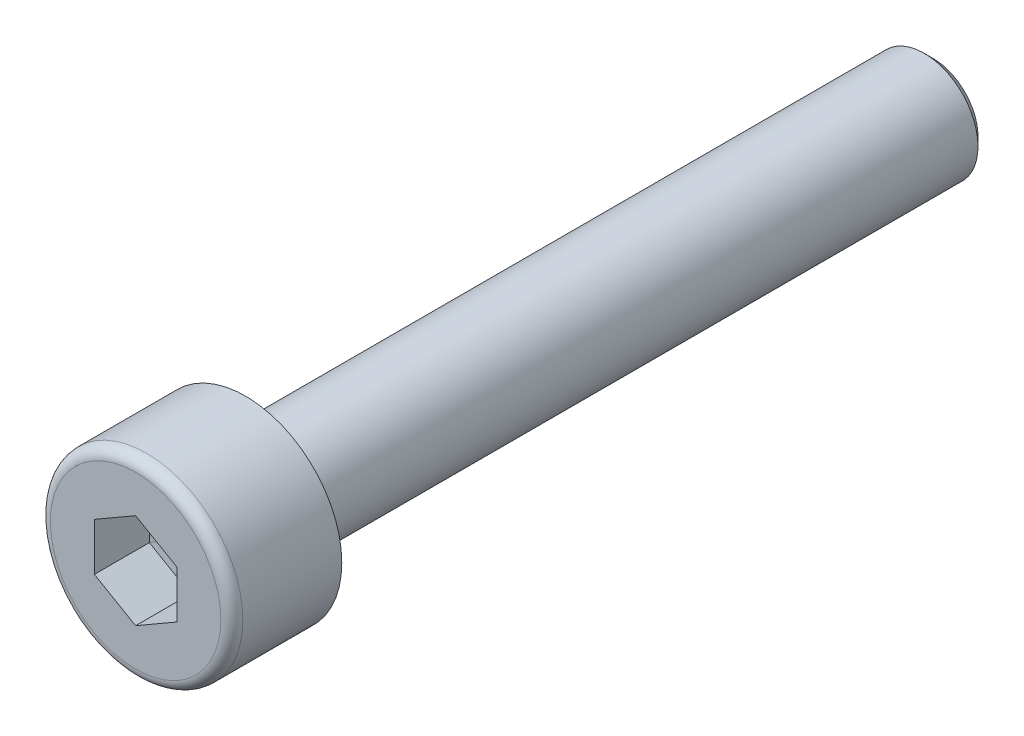
ISO-10303-21;
HEADER;
FILE_DESCRIPTION(('STEP AP214'),'2;1');
FILE_NAME('part.step','',(''),(''),'','','');
FILE_SCHEMA(('AUTOMOTIVE_DESIGN { 1 0 10303 214 1 1 1 1 }'));
ENDSEC;
DATA;
#1=APPLICATION_CONTEXT('core data for automotive mechanical design processes');
#2=APPLICATION_PROTOCOL_DEFINITION('international standard','automotive_design',2000,#1);
#3=PRODUCT_CONTEXT('',#1,'mechanical');
#4=PRODUCT('Part','Part','',(#3));
#5=PRODUCT_RELATED_PRODUCT_CATEGORY('part','',(#4));
#6=PRODUCT_DEFINITION_FORMATION('','',#4);
#7=PRODUCT_DEFINITION_CONTEXT('part definition',#1,'design');
#8=PRODUCT_DEFINITION('design','',#6,#7);
#9=PRODUCT_DEFINITION_SHAPE('','',#8);
#10=(LENGTH_UNIT() NAMED_UNIT(*) SI_UNIT(.MILLI.,.METRE.));
#11=(NAMED_UNIT(*) PLANE_ANGLE_UNIT() SI_UNIT($,.RADIAN.));
#12=(NAMED_UNIT(*) SI_UNIT($,.STERADIAN.) SOLID_ANGLE_UNIT());
#13=UNCERTAINTY_MEASURE_WITH_UNIT(LENGTH_MEASURE(1.E-05),#10,'distance_accuracy_value','');
#14=(GEOMETRIC_REPRESENTATION_CONTEXT(3) GLOBAL_UNCERTAINTY_ASSIGNED_CONTEXT((#13)) GLOBAL_UNIT_ASSIGNED_CONTEXT((#10,
#11,#12)) REPRESENTATION_CONTEXT('',''));
#15=CARTESIAN_POINT('',(0.,0.,0.));
#16=DIRECTION('',(0.,0.,1.));
#17=DIRECTION('',(1.,0.,0.));
#18=AXIS2_PLACEMENT_3D('',#15,#16,#17);
#19=CARTESIAN_POINT('',(-2.,0.,-5.5228302982804E-13));
#20=DIRECTION('',(0.,0.,-1.));
#21=DIRECTION('',(0.,-1.,0.));
#22=AXIS2_PLACEMENT_3D('',#19,#20,#21);
#23=PLANE('',#22);
#24=CARTESIAN_POINT('',(0.,0.,-5.48450174164827E-13));
#25=DIRECTION('',(0.,0.,-1.));
#26=DIRECTION('',(-1.,0.,0.));
#27=AXIS2_PLACEMENT_3D('',#24,#25,#26);
#28=CIRCLE('',#27,1.954);
#29=CARTESIAN_POINT('',(1.954,0.,-5.45177515025882E-13));
#30=VERTEX_POINT('',#29);
#31=EDGE_CURVE('E11',#30,#30,#28,.T.);
#32=ORIENTED_EDGE('',*,*,#31,.F.);
#33=EDGE_LOOP('',(#32));
#34=FACE_BOUND('',#33,.T.);
#35=CARTESIAN_POINT('',(0.,0.,-9.60458843258252E-13));
#36=DIRECTION('',(0.,0.,-1.));
#37=DIRECTION('',(1.,0.,0.));
#38=AXIS2_PLACEMENT_3D('',#35,#36,#37);
#39=CIRCLE('',#38,3.5);
#40=CARTESIAN_POINT('',(3.5,0.,-9.54791801177635E-13));
#41=VERTEX_POINT('',#40);
#42=EDGE_CURVE('E172',#41,#41,#39,.T.);
#43=ORIENTED_EDGE('',*,*,#42,.T.);
#44=EDGE_LOOP('',(#43));
#45=FACE_BOUND('',#44,.T.);
#46=ADVANCED_FACE('F17',(#34,#45),#23,.T.);
#47=CARTESIAN_POINT('',(0.,0.,-25.));
#48=DIRECTION('',(0.,0.,-1.));
#49=DIRECTION('',(0.,-1.,0.));
#50=AXIS2_PLACEMENT_3D('',#47,#48,#49);
#51=PLANE('',#50);
#52=CARTESIAN_POINT('',(0.,0.,-25.));
#53=DIRECTION('',(0.,0.,-1.));
#54=DIRECTION('',(-1.,0.,0.));
#55=AXIS2_PLACEMENT_3D('',#52,#53,#54);
#56=CIRCLE('',#55,1.64000000000802);
#57=CARTESIAN_POINT('',(1.64000000000802,0.,-25.));
#58=VERTEX_POINT('',#57);
#59=EDGE_CURVE('E124',#58,#58,#56,.T.);
#60=ORIENTED_EDGE('',*,*,#59,.T.);
#61=EDGE_LOOP('',(#60));
#62=FACE_BOUND('',#61,.T.);
#63=ADVANCED_FACE('F501',(#62),#51,.T.);
#64=CARTESIAN_POINT('',(0.,0.,-12.5000000000003));
#65=DIRECTION('',(0.,0.,-1.));
#66=DIRECTION('',(-1.,0.,0.));
#67=AXIS2_PLACEMENT_3D('',#64,#65,#66);
#68=CYLINDRICAL_SURFACE('',#67,1.954);
#69=CARTESIAN_POINT('',(0.,0.,-24.6860000000083));
#70=DIRECTION('',(0.,0.,1.));
#71=DIRECTION('',(-1.,0.,0.));
#72=AXIS2_PLACEMENT_3D('',#69,#70,#71);
#73=CIRCLE('',#72,1.954);
#74=CARTESIAN_POINT('',(1.95400000000003,0.,-24.6860000000083));
#75=VERTEX_POINT('',#74);
#76=EDGE_CURVE('E117',#75,#75,#73,.T.);
#77=ORIENTED_EDGE('',*,*,#76,.T.);
#78=DIRECTION('',(0.,0.,1.));
#79=VECTOR('',#78,1.);
#80=CARTESIAN_POINT('',(1.954,0.,-12.5000000000003));
#81=LINE('',#80,#79);
#82=EDGE_CURVE('E20',#75,#30,#81,.T.);
#83=ORIENTED_EDGE('',*,*,#82,.T.);
#84=ORIENTED_EDGE('',*,*,#31,.T.);
#85=ORIENTED_EDGE('',*,*,#82,.F.);
#86=EDGE_LOOP('',(#77,#83,#84,#85));
#87=FACE_BOUND('',#86,.T.);
#88=ADVANCED_FACE('F115',(#87),#68,.T.);
#89=CARTESIAN_POINT('',(-1.5,0.866025403784439,4.));
#90=DIRECTION('',(-0.5,0.866025403784439,0.));
#91=DIRECTION('',(0.,0.,1.));
#92=AXIS2_PLACEMENT_3D('',#89,#90,#91);
#93=PLANE('',#92);
#94=DIRECTION('',(0.866025403784439,0.5,0.));
#95=VECTOR('',#94,1.);
#96=CARTESIAN_POINT('',(-2.4375,0.324759526419163,3.99999999999962));
#97=LINE('',#96,#95);
#98=CARTESIAN_POINT('',(-1.5,0.866025403784439,4.));
#99=VERTEX_POINT('',#98);
#100=CARTESIAN_POINT('',(0.,1.73205080756888,4.));
#101=VERTEX_POINT('',#100);
#102=EDGE_CURVE('E164',#99,#101,#97,.T.);
#103=ORIENTED_EDGE('',*,*,#102,.F.);
#104=DIRECTION('',(0.,0.,-1.));
#105=VECTOR('',#104,1.);
#106=CARTESIAN_POINT('',(-1.5,0.866025403784439,4.));
#107=LINE('',#106,#105);
#108=CARTESIAN_POINT('',(-1.5,0.866025403784439,2.));
#109=VERTEX_POINT('',#108);
#110=EDGE_CURVE('E224',#99,#109,#107,.T.);
#111=ORIENTED_EDGE('',*,*,#110,.T.);
#112=DIRECTION('',(0.866025403784439,0.5,0.));
#113=VECTOR('',#112,1.);
#114=CARTESIAN_POINT('',(0.,1.73205080756888,2.));
#115=LINE('',#114,#113);
#116=CARTESIAN_POINT('',(0.,1.73205080756888,2.));
#117=VERTEX_POINT('',#116);
#118=EDGE_CURVE('E185',#109,#117,#115,.T.);
#119=ORIENTED_EDGE('',*,*,#118,.T.);
#120=DIRECTION('',(0.,0.,-1.));
#121=VECTOR('',#120,1.);
#122=CARTESIAN_POINT('',(0.,1.73205080756888,4.));
#123=LINE('',#122,#121);
#124=EDGE_CURVE('E45',#101,#117,#123,.T.);
#125=ORIENTED_EDGE('',*,*,#124,.F.);
#126=EDGE_LOOP('',(#103,#111,#119,#125));
#127=FACE_BOUND('',#126,.T.);
#128=ADVANCED_FACE('F485',(#127),#93,.F.);
#129=CARTESIAN_POINT('',(0.,1.73205080756888,4.));
#130=DIRECTION('',(0.5,0.866025403784438,0.));
#131=DIRECTION('',(0.,0.,-1.));
#132=AXIS2_PLACEMENT_3D('',#129,#130,#131);
#133=PLANE('',#132);
#134=DIRECTION('',(0.866025403784438,-0.5,0.));
#135=VECTOR('',#134,1.);
#136=CARTESIAN_POINT('',(-0.9375,2.27331668493415,3.99999999999962));
#137=LINE('',#136,#135);
#138=CARTESIAN_POINT('',(1.5,0.866025403784438,4.));
#139=VERTEX_POINT('',#138);
#140=EDGE_CURVE('E167',#101,#139,#137,.T.);
#141=ORIENTED_EDGE('',*,*,#140,.F.);
#142=ORIENTED_EDGE('',*,*,#124,.T.);
#143=DIRECTION('',(0.866025403784438,-0.5,0.));
#144=VECTOR('',#143,1.);
#145=CARTESIAN_POINT('',(1.5,0.866025403784438,2.));
#146=LINE('',#145,#144);
#147=CARTESIAN_POINT('',(1.5,0.866025403784438,2.));
#148=VERTEX_POINT('',#147);
#149=EDGE_CURVE('E217',#117,#148,#146,.T.);
#150=ORIENTED_EDGE('',*,*,#149,.T.);
#151=DIRECTION('',(0.,0.,-1.));
#152=VECTOR('',#151,1.);
#153=CARTESIAN_POINT('',(1.5,0.866025403784438,4.));
#154=LINE('',#153,#152);
#155=EDGE_CURVE('E233',#139,#148,#154,.T.);
#156=ORIENTED_EDGE('',*,*,#155,.F.);
#157=EDGE_LOOP('',(#141,#142,#150,#156));
#158=FACE_BOUND('',#157,.T.);
#159=ADVANCED_FACE('F475',(#158),#133,.F.);
#160=CARTESIAN_POINT('',(1.5,0.866025403784438,4.));
#161=DIRECTION('',(1.,0.,0.));
#162=DIRECTION('',(0.,-1.,0.));
#163=AXIS2_PLACEMENT_3D('',#160,#161,#162);
#164=PLANE('',#163);
#165=DIRECTION('',(0.,-1.,0.));
#166=VECTOR('',#165,1.);
#167=CARTESIAN_POINT('',(1.5,0.433012701892219,3.99999999999963));
#168=LINE('',#167,#166);
#169=CARTESIAN_POINT('',(1.5,-0.866025403784439,4.));
#170=VERTEX_POINT('',#169);
#171=EDGE_CURVE('E151',#139,#170,#168,.T.);
#172=ORIENTED_EDGE('',*,*,#171,.F.);
#173=ORIENTED_EDGE('',*,*,#155,.T.);
#174=DIRECTION('',(0.,-1.,0.));
#175=VECTOR('',#174,1.);
#176=CARTESIAN_POINT('',(1.5,-0.866025403784439,2.));
#177=LINE('',#176,#175);
#178=CARTESIAN_POINT('',(1.5,-0.866025403784439,2.));
#179=VERTEX_POINT('',#178);
#180=EDGE_CURVE('E209',#148,#179,#177,.T.);
#181=ORIENTED_EDGE('',*,*,#180,.T.);
#182=DIRECTION('',(0.,0.,-1.));
#183=VECTOR('',#182,1.);
#184=CARTESIAN_POINT('',(1.5,-0.866025403784439,4.));
#185=LINE('',#184,#183);
#186=EDGE_CURVE('E230',#170,#179,#185,.T.);
#187=ORIENTED_EDGE('',*,*,#186,.F.);
#188=EDGE_LOOP('',(#172,#173,#181,#187));
#189=FACE_BOUND('',#188,.T.);
#190=ADVANCED_FACE('F464',(#189),#164,.F.);
#191=CARTESIAN_POINT('',(1.5,-0.866025403784439,4.));
#192=DIRECTION('',(0.5,-0.866025403784439,0.));
#193=DIRECTION('',(0.,0.,-1.));
#194=AXIS2_PLACEMENT_3D('',#191,#192,#193);
#195=PLANE('',#194);
#196=DIRECTION('',(-0.866025403784439,-0.5,0.));
#197=VECTOR('',#196,1.);
#198=CARTESIAN_POINT('',(-0.187500000000004,-1.84030398304193,3.99999999999962));
#199=LINE('',#198,#197);
#200=CARTESIAN_POINT('',(0.,-1.73205080756888,4.));
#201=VERTEX_POINT('',#200);
#202=EDGE_CURVE('E146',#170,#201,#199,.T.);
#203=ORIENTED_EDGE('',*,*,#202,.F.);
#204=ORIENTED_EDGE('',*,*,#186,.T.);
#205=DIRECTION('',(-0.866025403784439,-0.5,0.));
#206=VECTOR('',#205,1.);
#207=CARTESIAN_POINT('',(0.,-1.73205080756888,2.));
#208=LINE('',#207,#206);
#209=CARTESIAN_POINT('',(0.,-1.73205080756888,2.));
#210=VERTEX_POINT('',#209);
#211=EDGE_CURVE('E201',#179,#210,#208,.T.);
#212=ORIENTED_EDGE('',*,*,#211,.T.);
#213=DIRECTION('',(0.,0.,-1.));
#214=VECTOR('',#213,1.);
#215=CARTESIAN_POINT('',(0.,-1.73205080756888,4.));
#216=LINE('',#215,#214);
#217=EDGE_CURVE('E227',#201,#210,#216,.T.);
#218=ORIENTED_EDGE('',*,*,#217,.F.);
#219=EDGE_LOOP('',(#203,#204,#212,#218));
#220=FACE_BOUND('',#219,.T.);
#221=ADVANCED_FACE('F454',(#220),#195,.F.);
#222=CARTESIAN_POINT('',(0.,-1.73205080756888,4.));
#223=DIRECTION('',(-0.5,-0.866025403784439,0.));
#224=DIRECTION('',(-0.866025403784439,0.5,0.));
#225=AXIS2_PLACEMENT_3D('',#222,#223,#224);
#226=PLANE('',#225);
#227=DIRECTION('',(-0.866025403784439,0.5,0.));
#228=VECTOR('',#227,1.);
#229=CARTESIAN_POINT('',(-1.6875,-0.757772228311381,3.99999999999962));
#230=LINE('',#229,#228);
#231=CARTESIAN_POINT('',(-1.5,-0.866025403784438,4.));
#232=VERTEX_POINT('',#231);
#233=EDGE_CURVE('E150',#201,#232,#230,.T.);
#234=ORIENTED_EDGE('',*,*,#233,.F.);
#235=ORIENTED_EDGE('',*,*,#217,.T.);
#236=DIRECTION('',(-0.866025403784439,0.5,0.));
#237=VECTOR('',#236,1.);
#238=CARTESIAN_POINT('',(-1.5,-0.866025403784438,2.));
#239=LINE('',#238,#237);
#240=CARTESIAN_POINT('',(-1.5,-0.866025403784438,2.));
#241=VERTEX_POINT('',#240);
#242=EDGE_CURVE('E193',#210,#241,#239,.T.);
#243=ORIENTED_EDGE('',*,*,#242,.T.);
#244=DIRECTION('',(0.,0.,-1.));
#245=VECTOR('',#244,1.);
#246=CARTESIAN_POINT('',(-1.5,-0.866025403784438,4.));
#247=LINE('',#246,#245);
#248=EDGE_CURVE('E188',#232,#241,#247,.T.);
#249=ORIENTED_EDGE('',*,*,#248,.F.);
#250=EDGE_LOOP('',(#234,#235,#243,#249));
#251=FACE_BOUND('',#250,.T.);
#252=ADVANCED_FACE('F445',(#251),#226,.F.);
#253=CARTESIAN_POINT('',(-1.5,-0.866025403784438,4.));
#254=DIRECTION('',(-1.,0.,0.));
#255=DIRECTION('',(0.,0.,1.));
#256=AXIS2_PLACEMENT_3D('',#253,#254,#255);
#257=PLANE('',#256);
#258=DIRECTION('',(0.,1.,0.));
#259=VECTOR('',#258,1.);
#260=CARTESIAN_POINT('',(-1.5,-0.433012701892219,3.99999999999962));
#261=LINE('',#260,#259);
#262=EDGE_CURVE('E141',#232,#99,#261,.T.);
#263=ORIENTED_EDGE('',*,*,#262,.F.);
#264=ORIENTED_EDGE('',*,*,#248,.T.);
#265=DIRECTION('',(0.,1.,0.));
#266=VECTOR('',#265,1.);
#267=CARTESIAN_POINT('',(-1.5,0.866025403784439,2.));
#268=LINE('',#267,#266);
#269=EDGE_CURVE('E155',#241,#109,#268,.T.);
#270=ORIENTED_EDGE('',*,*,#269,.T.);
#271=ORIENTED_EDGE('',*,*,#110,.F.);
#272=EDGE_LOOP('',(#263,#264,#270,#271));
#273=FACE_BOUND('',#272,.T.);
#274=ADVANCED_FACE('F435',(#273),#257,.F.);
#275=CARTESIAN_POINT('',(0.,1.73205080756888,2.));
#276=DIRECTION('',(-0.043577871373829,0.0754790873051733,-0.996194698091746));
#277=DIRECTION('',(-0.999044587684655,0.,0.043702537889669));
#278=AXIS2_PLACEMENT_3D('',#275,#276,#277);
#279=PLANE('',#278);
#280=DIRECTION('',(0.,-0.997141949694317,-0.0755508581011306));
#281=VECTOR('',#280,1.);
#282=CARTESIAN_POINT('',(0.,1.3015097128034,1.96737901843634));
#283=LINE('',#282,#281);
#284=CARTESIAN_POINT('',(0.,0.,1.86876700471111));
#285=VERTEX_POINT('',#284);
#286=EDGE_CURVE('E189',#117,#285,#283,.T.);
#287=ORIENTED_EDGE('',*,*,#286,.F.);
#288=ORIENTED_EDGE('',*,*,#118,.F.);
#289=DIRECTION('',(0.863550259614423,-0.498570974847158,-0.0755508581011305));
#290=VECTOR('',#289,1.);
#291=CARTESIAN_POINT('',(-1.12714047455993,0.650754856401699,1.96737901843634));
#292=LINE('',#291,#290);
#293=EDGE_CURVE('E160',#109,#285,#292,.T.);
#294=ORIENTED_EDGE('',*,*,#293,.T.);
#295=EDGE_LOOP('',(#287,#288,#294));
#296=FACE_BOUND('',#295,.T.);
#297=ADVANCED_FACE('F425',(#296),#279,.F.);
#298=CARTESIAN_POINT('',(1.5,0.866025403784438,2.));
#299=DIRECTION('',(0.0435778713738291,0.0754790873051733,-0.996194698091746));
#300=DIRECTION('',(-0.999044587684655,0.,-0.0437025378896691));
#301=AXIS2_PLACEMENT_3D('',#298,#299,#300);
#302=PLANE('',#301);
#303=DIRECTION('',(-0.863550259614423,-0.498570974847158,-0.0755508581011305));
#304=VECTOR('',#303,1.);
#305=CARTESIAN_POINT('',(1.12714047455993,0.650754856401699,1.96737901843634));
#306=LINE('',#305,#304);
#307=EDGE_CURVE('E213',#148,#285,#306,.T.);
#308=ORIENTED_EDGE('',*,*,#307,.F.);
#309=ORIENTED_EDGE('',*,*,#149,.F.);
#310=ORIENTED_EDGE('',*,*,#286,.T.);
#311=EDGE_LOOP('',(#308,#309,#310));
#312=FACE_BOUND('',#311,.T.);
#313=ADVANCED_FACE('F416',(#312),#302,.F.);
#314=CARTESIAN_POINT('',(1.5,-0.866025403784439,2.));
#315=DIRECTION('',(0.0871557427476581,0.,-0.996194698091746));
#316=DIRECTION('',(0.,-1.,0.));
#317=AXIS2_PLACEMENT_3D('',#314,#315,#316);
#318=PLANE('',#317);
#319=DIRECTION('',(-0.863550259614423,0.498570974847159,-0.0755508581011305));
#320=VECTOR('',#319,1.);
#321=CARTESIAN_POINT('',(1.12714047455993,-0.650754856401699,1.96737901843634));
#322=LINE('',#321,#320);
#323=EDGE_CURVE('E205',#179,#285,#322,.T.);
#324=ORIENTED_EDGE('',*,*,#323,.F.);
#325=ORIENTED_EDGE('',*,*,#180,.F.);
#326=ORIENTED_EDGE('',*,*,#307,.T.);
#327=EDGE_LOOP('',(#324,#325,#326));
#328=FACE_BOUND('',#327,.T.);
#329=ADVANCED_FACE('F406',(#328),#318,.F.);
#330=CARTESIAN_POINT('',(0.,-1.73205080756888,2.));
#331=DIRECTION('',(0.043577871373829,-0.0754790873051733,-0.996194698091746));
#332=DIRECTION('',(0.,-0.997141949694317,0.0755508581011305));
#333=AXIS2_PLACEMENT_3D('',#330,#331,#332);
#334=PLANE('',#333);
#335=DIRECTION('',(0.,0.997141949694317,-0.0755508581011306));
#336=VECTOR('',#335,1.);
#337=CARTESIAN_POINT('',(0.,-1.3015097128034,1.96737901843634));
#338=LINE('',#337,#336);
#339=EDGE_CURVE('E197',#210,#285,#338,.T.);
#340=ORIENTED_EDGE('',*,*,#339,.F.);
#341=ORIENTED_EDGE('',*,*,#211,.F.);
#342=ORIENTED_EDGE('',*,*,#323,.T.);
#343=EDGE_LOOP('',(#340,#341,#342));
#344=FACE_BOUND('',#343,.T.);
#345=ADVANCED_FACE('F396',(#344),#334,.F.);
#346=CARTESIAN_POINT('',(-1.5,-0.866025403784438,2.));
#347=DIRECTION('',(-0.0435778713738291,-0.0754790873051733,-0.996194698091746));
#348=DIRECTION('',(0.,-0.997141949694317,0.0755508581011305));
#349=AXIS2_PLACEMENT_3D('',#346,#347,#348);
#350=PLANE('',#349);
#351=DIRECTION('',(0.863550259614423,0.498570974847158,-0.0755508581011305));
#352=VECTOR('',#351,1.);
#353=CARTESIAN_POINT('',(-1.12714047455993,-0.650754856401699,1.96737901843634));
#354=LINE('',#353,#352);
#355=EDGE_CURVE('E159',#241,#285,#354,.T.);
#356=ORIENTED_EDGE('',*,*,#355,.F.);
#357=ORIENTED_EDGE('',*,*,#242,.F.);
#358=ORIENTED_EDGE('',*,*,#339,.T.);
#359=EDGE_LOOP('',(#356,#357,#358));
#360=FACE_BOUND('',#359,.T.);
#361=ADVANCED_FACE('F386',(#360),#350,.F.);
#362=CARTESIAN_POINT('',(-1.5,0.866025403784439,2.));
#363=DIRECTION('',(-0.0871557427476581,0.,-0.996194698091746));
#364=DIRECTION('',(-0.996194698091746,0.,0.0871557427476581));
#365=AXIS2_PLACEMENT_3D('',#362,#363,#364);
#366=PLANE('',#365);
#367=ORIENTED_EDGE('',*,*,#293,.F.);
#368=ORIENTED_EDGE('',*,*,#269,.F.);
#369=ORIENTED_EDGE('',*,*,#355,.T.);
#370=EDGE_LOOP('',(#367,#368,#369));
#371=FACE_BOUND('',#370,.T.);
#372=ADVANCED_FACE('F375',(#371),#366,.F.);
#373=CARTESIAN_POINT('',(0.,0.,1.99999999999933));
#374=DIRECTION('',(0.,0.,-1.));
#375=DIRECTION('',(-1.,0.,0.));
#376=AXIS2_PLACEMENT_3D('',#373,#374,#375);
#377=CYLINDRICAL_SURFACE('',#376,3.5);
#378=ORIENTED_EDGE('',*,*,#42,.F.);
#379=DIRECTION('',(0.,0.,1.));
#380=VECTOR('',#379,1.);
#381=CARTESIAN_POINT('',(3.5,0.,1.99999999999934));
#382=LINE('',#381,#380);
#383=CARTESIAN_POINT('',(3.49999999999996,0.,3.59999999999963));
#384=VERTEX_POINT('',#383);
#385=EDGE_CURVE('E137',#41,#384,#382,.T.);
#386=ORIENTED_EDGE('',*,*,#385,.T.);
#387=CARTESIAN_POINT('',(0.,0.,3.59999999999963));
#388=DIRECTION('',(0.,0.,1.));
#389=DIRECTION('',(1.,0.,0.));
#390=AXIS2_PLACEMENT_3D('',#387,#388,#389);
#391=CIRCLE('',#390,3.5);
#392=EDGE_CURVE('E132',#384,#384,#391,.T.);
#393=ORIENTED_EDGE('',*,*,#392,.F.);
#394=ORIENTED_EDGE('',*,*,#385,.F.);
#395=EDGE_LOOP('',(#378,#386,#393,#394));
#396=FACE_BOUND('',#395,.T.);
#397=ADVANCED_FACE('F365',(#396),#377,.T.);
#398=CARTESIAN_POINT('',(-3.5,0.,3.99999999999962));
#399=DIRECTION('',(0.,0.,1.));
#400=DIRECTION('',(1.,0.,0.));
#401=AXIS2_PLACEMENT_3D('',#398,#399,#400);
#402=PLANE('',#401);
#403=ORIENTED_EDGE('',*,*,#262,.T.);
#404=ORIENTED_EDGE('',*,*,#102,.T.);
#405=ORIENTED_EDGE('',*,*,#140,.T.);
#406=ORIENTED_EDGE('',*,*,#171,.T.);
#407=ORIENTED_EDGE('',*,*,#202,.T.);
#408=ORIENTED_EDGE('',*,*,#233,.T.);
#409=EDGE_LOOP('',(#403,#404,#405,#406,#407,#408));
#410=FACE_BOUND('',#409,.T.);
#411=CARTESIAN_POINT('',(0.,0.,3.99999999999963));
#412=DIRECTION('',(0.,0.,-1.));
#413=DIRECTION('',(1.,0.,0.));
#414=AXIS2_PLACEMENT_3D('',#411,#412,#413);
#415=CIRCLE('',#414,3.1);
#416=CARTESIAN_POINT('',(3.09999999999996,0.,3.99999999999963));
#417=VERTEX_POINT('',#416);
#418=EDGE_CURVE('E138',#417,#417,#415,.T.);
#419=ORIENTED_EDGE('',*,*,#418,.F.);
#420=EDGE_LOOP('',(#419));
#421=FACE_BOUND('',#420,.T.);
#422=ADVANCED_FACE('F355',(#410,#421),#402,.T.);
#423=CARTESIAN_POINT('',(0.,0.,3.59999999999963));
#424=DIRECTION('',(0.,0.,-1.));
#425=DIRECTION('',(-1.,0.,0.));
#426=AXIS2_PLACEMENT_3D('',#423,#424,#425);
#427=TOROIDAL_SURFACE('',#426,3.1,0.4);
#428=ORIENTED_EDGE('',*,*,#392,.T.);
#429=CARTESIAN_POINT('',(3.09999999999996,0.,3.59999999999963));
#430=DIRECTION('',(0.,-1.,0.));
#431=DIRECTION('',(1.,0.,0.));
#432=AXIS2_PLACEMENT_3D('',#429,#430,#431);
#433=CIRCLE('',#432,0.4);
#434=EDGE_CURVE('E142',#384,#417,#433,.T.);
#435=ORIENTED_EDGE('',*,*,#434,.T.);
#436=ORIENTED_EDGE('',*,*,#418,.T.);
#437=ORIENTED_EDGE('',*,*,#434,.F.);
#438=EDGE_LOOP('',(#428,#435,#436,#437));
#439=FACE_BOUND('',#438,.T.);
#440=ADVANCED_FACE('F343',(#439),#427,.T.);
#441=CARTESIAN_POINT('',(0.,0.,-24.8));
#442=DIRECTION('',(0.,0.,1.));
#443=DIRECTION('',(-1.,0.,0.));
#444=AXIS2_PLACEMENT_3D('',#441,#442,#443);
#445=CONICAL_SURFACE('',#444,1.84000000000822,0.785398163397964);
#446=ORIENTED_EDGE('',*,*,#76,.F.);
#447=DIRECTION('',(-0.707106781186912,0.,-0.707106781186183));
#448=VECTOR('',#447,1.);
#449=CARTESIAN_POINT('',(1.84000000000822,0.,-24.8));
#450=LINE('',#449,#448);
#451=EDGE_CURVE('E122',#75,#58,#450,.T.);
#452=ORIENTED_EDGE('',*,*,#451,.T.);
#453=ORIENTED_EDGE('',*,*,#59,.F.);
#454=ORIENTED_EDGE('',*,*,#451,.F.);
#455=EDGE_LOOP('',(#446,#452,#453,#454));
#456=FACE_BOUND('',#455,.T.);
#457=ADVANCED_FACE('F123',(#456),#445,.T.);
#458=CLOSED_SHELL('',(#46,#63,#88,#128,#159,#190,#221,#252,#274,#297,#313,#329,#345,#361,#372,
#397,#422,#440,#457));
#459=MANIFOLD_SOLID_BREP('B1',#458);
#460=ADVANCED_BREP_SHAPE_REPRESENTATION('',(#18,#459),#14);
#461=SHAPE_DEFINITION_REPRESENTATION(#9,#460);
ENDSEC;
END-ISO-10303-21;
